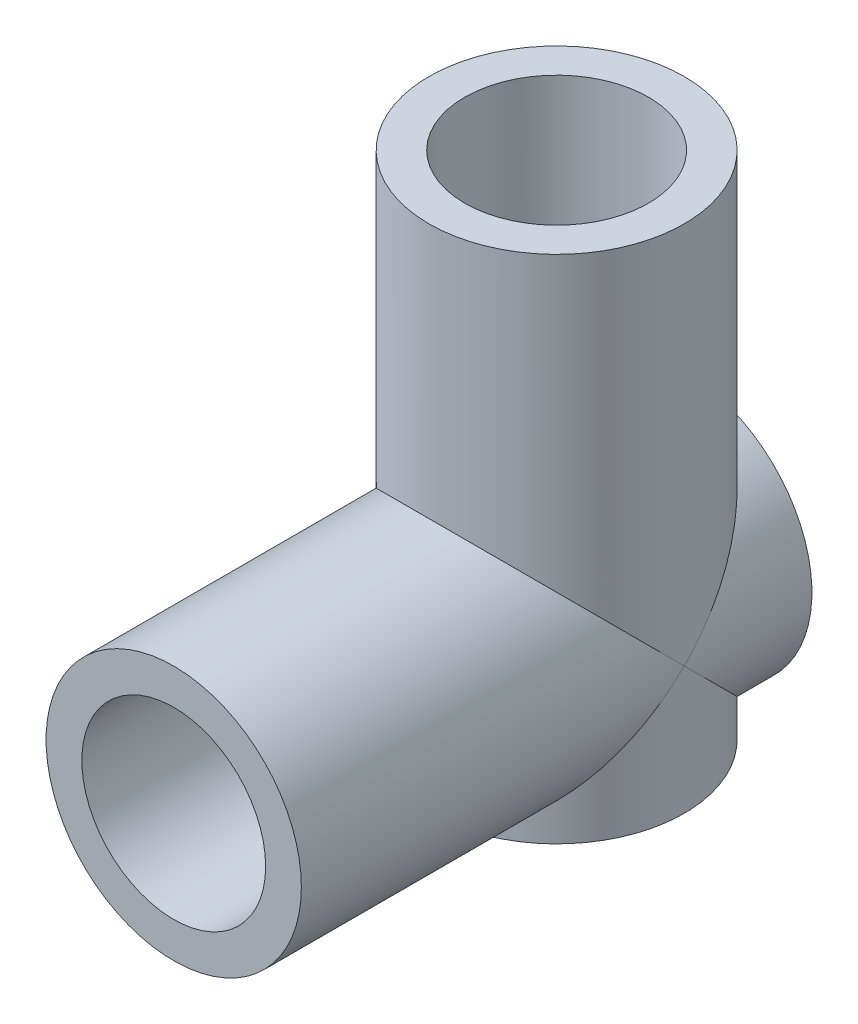
ISO-10303-21;
HEADER;
FILE_DESCRIPTION(('STEP AP214'),'2;1');
FILE_NAME('part.step','',(''),(''),'','','');
FILE_SCHEMA(('AUTOMOTIVE_DESIGN { 1 0 10303 214 1 1 1 1 }'));
ENDSEC;
DATA;
#1=APPLICATION_CONTEXT('core data for automotive mechanical design processes');
#2=APPLICATION_PROTOCOL_DEFINITION('international standard','automotive_design',2000,#1);
#3=PRODUCT_CONTEXT('',#1,'mechanical');
#4=PRODUCT('Part','Part','',(#3));
#5=PRODUCT_RELATED_PRODUCT_CATEGORY('part','',(#4));
#6=PRODUCT_DEFINITION_FORMATION('','',#4);
#7=PRODUCT_DEFINITION_CONTEXT('part definition',#1,'design');
#8=PRODUCT_DEFINITION('design','',#6,#7);
#9=PRODUCT_DEFINITION_SHAPE('','',#8);
#10=(LENGTH_UNIT() NAMED_UNIT(*) SI_UNIT(.MILLI.,.METRE.));
#11=(NAMED_UNIT(*) PLANE_ANGLE_UNIT() SI_UNIT($,.RADIAN.));
#12=(NAMED_UNIT(*) SI_UNIT($,.STERADIAN.) SOLID_ANGLE_UNIT());
#13=UNCERTAINTY_MEASURE_WITH_UNIT(LENGTH_MEASURE(1.E-05),#10,'distance_accuracy_value','');
#14=(GEOMETRIC_REPRESENTATION_CONTEXT(3) GLOBAL_UNCERTAINTY_ASSIGNED_CONTEXT((#13)) GLOBAL_UNIT_ASSIGNED_CONTEXT((#10,
#11,#12)) REPRESENTATION_CONTEXT('',''));
#15=CARTESIAN_POINT('',(0.,0.,0.));
#16=DIRECTION('',(0.,0.,1.));
#17=DIRECTION('',(1.,0.,0.));
#18=AXIS2_PLACEMENT_3D('',#15,#16,#17);
#19=CARTESIAN_POINT('',(0.,11.25,3.75));
#20=DIRECTION('',(0.,-1.,0.));
#21=DIRECTION('',(0.,0.,-1.));
#22=AXIS2_PLACEMENT_3D('',#19,#20,#21);
#23=CYLINDRICAL_SURFACE('',#22,2.7);
#24=CARTESIAN_POINT('',(0.,11.25,3.75));
#25=DIRECTION('',(0.,1.,0.));
#26=DIRECTION('',(0.,0.,1.));
#27=AXIS2_PLACEMENT_3D('',#24,#25,#26);
#28=CIRCLE('',#27,2.7);
#29=CARTESIAN_POINT('',(0.,11.25,6.45));
#30=VERTEX_POINT('',#29);
#31=EDGE_CURVE('E276',#30,#30,#28,.T.);
#32=ORIENTED_EDGE('',*,*,#31,.T.);
#33=EDGE_LOOP('',(#32));
#34=FACE_BOUND('',#33,.T.);
#35=CARTESIAN_POINT('',(0.,0.,3.75));
#36=DIRECTION('',(0.,-0.707106781186547,-0.707106781186547));
#37=DIRECTION('',(0.,-0.707106781186547,0.707106781186547));
#38=AXIS2_PLACEMENT_3D('',#35,#36,#37);
#39=ELLIPSE('',#38,3.81837661840736,2.7);
#40=CARTESIAN_POINT('',(-2.59374246986859,0.750000000000001,3.));
#41=VERTEX_POINT('',#40);
#42=CARTESIAN_POINT('',(-2.7,0.,3.75));
#43=VERTEX_POINT('',#42);
#44=EDGE_CURVE('E55',#41,#43,#39,.F.);
#45=ORIENTED_EDGE('',*,*,#44,.F.);
#46=DIRECTION('',(0.,-1.,0.));
#47=VECTOR('',#46,1.);
#48=CARTESIAN_POINT('',(-2.59374246986859,11.25,3.));
#49=LINE('',#48,#47);
#50=CARTESIAN_POINT('',(-2.59374246986859,-0.750000000000001,3.));
#51=VERTEX_POINT('',#50);
#52=EDGE_CURVE('E121',#41,#51,#49,.T.);
#53=ORIENTED_EDGE('',*,*,#52,.T.);
#54=CARTESIAN_POINT('',(0.,0.,3.75));
#55=DIRECTION('',(0.,0.707106781186547,-0.707106781186547));
#56=DIRECTION('',(0.,-0.707106781186547,-0.707106781186547));
#57=AXIS2_PLACEMENT_3D('',#54,#55,#56);
#58=ELLIPSE('',#57,3.81837661840736,2.7);
#59=CARTESIAN_POINT('',(2.59374246986859,-0.750000000000001,3.));
#60=VERTEX_POINT('',#59);
#61=EDGE_CURVE('E163',#51,#60,#58,.F.);
#62=ORIENTED_EDGE('',*,*,#61,.T.);
#63=DIRECTION('',(0.,-1.,0.));
#64=VECTOR('',#63,1.);
#65=CARTESIAN_POINT('',(2.59374246986859,11.25,3.));
#66=LINE('',#65,#64);
#67=CARTESIAN_POINT('',(2.59374246986859,0.750000000000001,3.));
#68=VERTEX_POINT('',#67);
#69=EDGE_CURVE('E128',#60,#68,#66,.F.);
#70=ORIENTED_EDGE('',*,*,#69,.T.);
#71=CARTESIAN_POINT('',(2.7,0.,3.75));
#72=VERTEX_POINT('',#71);
#73=EDGE_CURVE('E138',#72,#68,#39,.F.);
#74=ORIENTED_EDGE('',*,*,#73,.F.);
#75=CARTESIAN_POINT('',(0.,0.,3.75));
#76=DIRECTION('',(0.,-0.707106781186547,0.707106781186547));
#77=DIRECTION('',(0.,-0.707106781186547,-0.707106781186547));
#78=AXIS2_PLACEMENT_3D('',#75,#76,#77);
#79=ELLIPSE('',#78,3.81837661840736,2.7);
#80=EDGE_CURVE('E136',#43,#72,#79,.F.);
#81=ORIENTED_EDGE('',*,*,#80,.F.);
#82=EDGE_LOOP('',(#45,#53,#62,#70,#74,#81));
#83=FACE_BOUND('',#82,.T.);
#84=ADVANCED_FACE('F38',(#34,#83),#23,.F.);
#85=CARTESIAN_POINT('',(0.,0.,3.75));
#86=DIRECTION('',(0.,-0.707106781186547,-0.707106781186547));
#87=DIRECTION('',(0.,-0.707106781186547,0.707106781186547));
#88=AXIS2_PLACEMENT_3D('',#85,#86,#87);
#89=ELLIPSE('',#88,3.81837661840736,2.7);
#90=CARTESIAN_POINT('',(-2.59374246986859,-0.75,4.5));
#91=VERTEX_POINT('',#90);
#92=EDGE_CURVE('E139',#91,#43,#89,.T.);
#93=ORIENTED_EDGE('',*,*,#92,.F.);
#94=CARTESIAN_POINT('',(0.,-0.750000000000001,3.75));
#95=DIRECTION('',(0.,1.,0.));
#96=DIRECTION('',(0.,0.,1.));
#97=AXIS2_PLACEMENT_3D('',#94,#95,#96);
#98=CIRCLE('',#97,2.7);
#99=EDGE_CURVE('E147',#51,#91,#98,.T.);
#100=ORIENTED_EDGE('',*,*,#99,.F.);
#101=CARTESIAN_POINT('',(0.,0.,3.75));
#102=DIRECTION('',(0.,-0.707106781186547,0.707106781186547));
#103=DIRECTION('',(0.,-0.707106781186547,-0.707106781186547));
#104=AXIS2_PLACEMENT_3D('',#101,#102,#103);
#105=ELLIPSE('',#104,3.81837661840736,2.7);
#106=EDGE_CURVE('E132',#43,#51,#105,.T.);
#107=ORIENTED_EDGE('',*,*,#106,.F.);
#108=EDGE_LOOP('',(#93,#100,#107));
#109=FACE_BOUND('',#108,.T.);
#110=ADVANCED_FACE('F178',(#109),#23,.F.);
#111=EDGE_CURVE('E127',#60,#72,#105,.T.);
#112=ORIENTED_EDGE('',*,*,#111,.F.);
#113=CARTESIAN_POINT('',(2.59374246986859,-0.750000000000001,4.5));
#114=VERTEX_POINT('',#113);
#115=EDGE_CURVE('E159',#114,#60,#98,.T.);
#116=ORIENTED_EDGE('',*,*,#115,.F.);
#117=EDGE_CURVE('E143',#72,#114,#89,.T.);
#118=ORIENTED_EDGE('',*,*,#117,.F.);
#119=EDGE_LOOP('',(#112,#116,#118));
#120=FACE_BOUND('',#119,.T.);
#121=ADVANCED_FACE('F158',(#120),#23,.F.);
#122=CARTESIAN_POINT('',(0.,0.,15.));
#123=DIRECTION('',(0.,0.,-1.));
#124=DIRECTION('',(-1.,0.,0.));
#125=AXIS2_PLACEMENT_3D('',#122,#123,#124);
#126=CYLINDRICAL_SURFACE('',#125,2.7);
#127=CARTESIAN_POINT('',(0.,0.,15.));
#128=DIRECTION('',(0.,0.,1.));
#129=DIRECTION('',(1.,0.,0.));
#130=AXIS2_PLACEMENT_3D('',#127,#128,#129);
#131=CIRCLE('',#130,2.7);
#132=CARTESIAN_POINT('',(2.7,0.,15.));
#133=VERTEX_POINT('',#132);
#134=EDGE_CURVE('E353',#133,#133,#131,.T.);
#135=ORIENTED_EDGE('',*,*,#134,.T.);
#136=EDGE_LOOP('',(#135));
#137=FACE_BOUND('',#136,.T.);
#138=ORIENTED_EDGE('',*,*,#117,.T.);
#139=DIRECTION('',(0.,0.,-1.));
#140=VECTOR('',#139,1.);
#141=CARTESIAN_POINT('',(2.59374246986859,-0.750000000000001,15.));
#142=LINE('',#141,#140);
#143=EDGE_CURVE('E271',#114,#60,#142,.T.);
#144=ORIENTED_EDGE('',*,*,#143,.T.);
#145=ORIENTED_EDGE('',*,*,#61,.F.);
#146=DIRECTION('',(0.,0.,-1.));
#147=VECTOR('',#146,1.);
#148=CARTESIAN_POINT('',(-2.59374246986859,-0.750000000000001,15.));
#149=LINE('',#148,#147);
#150=EDGE_CURVE('E556',#51,#91,#149,.F.);
#151=ORIENTED_EDGE('',*,*,#150,.T.);
#152=ORIENTED_EDGE('',*,*,#92,.T.);
#153=ORIENTED_EDGE('',*,*,#80,.T.);
#154=EDGE_LOOP('',(#138,#144,#145,#151,#152,#153));
#155=FACE_BOUND('',#154,.T.);
#156=ADVANCED_FACE('F40',(#137,#155),#126,.F.);
#157=CARTESIAN_POINT('',(0.,0.,15.));
#158=DIRECTION('',(0.,0.,-1.));
#159=DIRECTION('',(-1.,0.,0.));
#160=AXIS2_PLACEMENT_3D('',#157,#158,#159);
#161=CYLINDRICAL_SURFACE('',#160,3.75);
#162=CARTESIAN_POINT('',(0.,0.,15.));
#163=DIRECTION('',(0.,0.,1.));
#164=DIRECTION('',(1.,0.,0.));
#165=AXIS2_PLACEMENT_3D('',#162,#163,#164);
#166=CIRCLE('',#165,3.75);
#167=CARTESIAN_POINT('',(3.75,0.,15.));
#168=VERTEX_POINT('',#167);
#169=EDGE_CURVE('E355',#168,#168,#166,.T.);
#170=ORIENTED_EDGE('',*,*,#169,.F.);
#171=EDGE_LOOP('',(#170));
#172=FACE_BOUND('',#171,.T.);
#173=CARTESIAN_POINT('',(0.,0.,3.75));
#174=DIRECTION('',(0.,-0.707106781186547,-0.707106781186547));
#175=DIRECTION('',(0.,0.707106781186547,-0.707106781186547));
#176=AXIS2_PLACEMENT_3D('',#173,#174,#175);
#177=ELLIPSE('',#176,5.30330085889911,3.75);
#178=CARTESIAN_POINT('',(3.75,0.,3.75));
#179=VERTEX_POINT('',#178);
#180=CARTESIAN_POINT('',(0.,-3.75,7.5));
#181=VERTEX_POINT('',#180);
#182=EDGE_CURVE('E348',#179,#181,#177,.T.);
#183=ORIENTED_EDGE('',*,*,#182,.F.);
#184=CARTESIAN_POINT('',(0.,0.,3.75));
#185=DIRECTION('',(0.,0.707106781186547,-0.707106781186547));
#186=DIRECTION('',(0.,-0.707106781186547,-0.707106781186547));
#187=AXIS2_PLACEMENT_3D('',#184,#185,#186);
#188=ELLIPSE('',#187,5.30330085889911,3.75);
#189=CARTESIAN_POINT('',(-3.75,0.,3.75));
#190=VERTEX_POINT('',#189);
#191=EDGE_CURVE('E340',#190,#179,#188,.T.);
#192=ORIENTED_EDGE('',*,*,#191,.F.);
#193=EDGE_CURVE('E345',#181,#190,#177,.T.);
#194=ORIENTED_EDGE('',*,*,#193,.F.);
#195=EDGE_LOOP('',(#183,#192,#194));
#196=FACE_BOUND('',#195,.T.);
#197=ADVANCED_FACE('F195',(#172,#196),#161,.T.);
#198=CARTESIAN_POINT('',(0.,0.,15.));
#199=DIRECTION('',(0.,0.,1.));
#200=DIRECTION('',(1.,0.,0.));
#201=AXIS2_PLACEMENT_3D('',#198,#199,#200);
#202=PLANE('',#201);
#203=ORIENTED_EDGE('',*,*,#134,.F.);
#204=EDGE_LOOP('',(#203));
#205=FACE_BOUND('',#204,.T.);
#206=ORIENTED_EDGE('',*,*,#169,.T.);
#207=EDGE_LOOP('',(#206));
#208=FACE_BOUND('',#207,.T.);
#209=ADVANCED_FACE('F302',(#205,#208),#202,.T.);
#210=CARTESIAN_POINT('',(0.,11.25,3.75));
#211=DIRECTION('',(0.,-1.,0.));
#212=DIRECTION('',(0.,0.,-1.));
#213=AXIS2_PLACEMENT_3D('',#210,#211,#212);
#214=CYLINDRICAL_SURFACE('',#213,3.75);
#215=CARTESIAN_POINT('',(0.,11.25,3.75));
#216=DIRECTION('',(0.,1.,0.));
#217=DIRECTION('',(0.,0.,1.));
#218=AXIS2_PLACEMENT_3D('',#215,#216,#217);
#219=CIRCLE('',#218,3.75);
#220=CARTESIAN_POINT('',(0.,11.25,7.5));
#221=VERTEX_POINT('',#220);
#222=EDGE_CURVE('E279',#221,#221,#219,.T.);
#223=ORIENTED_EDGE('',*,*,#222,.F.);
#224=EDGE_LOOP('',(#223));
#225=FACE_BOUND('',#224,.T.);
#226=ORIENTED_EDGE('',*,*,#191,.T.);
#227=CARTESIAN_POINT('',(0.,0.,3.75));
#228=DIRECTION('',(0.,-0.707106781186547,-0.707106781186547));
#229=DIRECTION('',(0.,0.707106781186547,-0.707106781186547));
#230=AXIS2_PLACEMENT_3D('',#227,#228,#229);
#231=ELLIPSE('',#230,5.30330085889911,3.75);
#232=CARTESIAN_POINT('',(0.,3.75,0.));
#233=VERTEX_POINT('',#232);
#234=EDGE_CURVE('E289',#179,#233,#231,.F.);
#235=ORIENTED_EDGE('',*,*,#234,.T.);
#236=EDGE_CURVE('E282',#233,#190,#231,.F.);
#237=ORIENTED_EDGE('',*,*,#236,.T.);
#238=EDGE_LOOP('',(#226,#235,#237));
#239=FACE_BOUND('',#238,.T.);
#240=ADVANCED_FACE('F249',(#225,#239),#214,.T.);
#241=CARTESIAN_POINT('',(0.,11.25,3.75));
#242=DIRECTION('',(0.,1.,0.));
#243=DIRECTION('',(0.,0.,1.));
#244=AXIS2_PLACEMENT_3D('',#241,#242,#243);
#245=PLANE('',#244);
#246=ORIENTED_EDGE('',*,*,#222,.T.);
#247=EDGE_LOOP('',(#246));
#248=FACE_BOUND('',#247,.T.);
#249=ORIENTED_EDGE('',*,*,#31,.F.);
#250=EDGE_LOOP('',(#249));
#251=FACE_BOUND('',#250,.T.);
#252=ADVANCED_FACE('F377',(#248,#251),#245,.T.);
#253=CARTESIAN_POINT('',(0.,-3.75,3.75));
#254=DIRECTION('',(0.,1.,0.));
#255=DIRECTION('',(0.,0.,1.));
#256=AXIS2_PLACEMENT_3D('',#253,#254,#255);
#257=CIRCLE('',#256,3.75);
#258=CARTESIAN_POINT('',(0.,-3.75,0.));
#259=VERTEX_POINT('',#258);
#260=EDGE_CURVE('E278',#259,#181,#257,.T.);
#261=ORIENTED_EDGE('',*,*,#260,.T.);
#262=ORIENTED_EDGE('',*,*,#193,.T.);
#263=CARTESIAN_POINT('',(0.,0.,3.75));
#264=DIRECTION('',(0.,0.707106781186547,-0.707106781186547));
#265=DIRECTION('',(0.,-0.707106781186547,-0.707106781186547));
#266=AXIS2_PLACEMENT_3D('',#263,#264,#265);
#267=ELLIPSE('',#266,5.30330085889911,3.75);
#268=EDGE_CURVE('E296',#190,#259,#267,.F.);
#269=ORIENTED_EDGE('',*,*,#268,.T.);
#270=EDGE_LOOP('',(#261,#262,#269));
#271=FACE_BOUND('',#270,.T.);
#272=ADVANCED_FACE('F258',(#271),#214,.T.);
#273=EDGE_CURVE('E334',#259,#179,#267,.F.);
#274=ORIENTED_EDGE('',*,*,#273,.T.);
#275=ORIENTED_EDGE('',*,*,#182,.T.);
#276=EDGE_CURVE('E283',#181,#259,#257,.T.);
#277=ORIENTED_EDGE('',*,*,#276,.T.);
#278=EDGE_LOOP('',(#274,#275,#277));
#279=FACE_BOUND('',#278,.T.);
#280=ADVANCED_FACE('F371',(#279),#214,.T.);
#281=CARTESIAN_POINT('',(0.,-3.75,3.75));
#282=DIRECTION('',(0.,1.,0.));
#283=DIRECTION('',(0.,0.,1.));
#284=AXIS2_PLACEMENT_3D('',#281,#282,#283);
#285=PLANE('',#284);
#286=ORIENTED_EDGE('',*,*,#276,.F.);
#287=ORIENTED_EDGE('',*,*,#260,.F.);
#288=EDGE_LOOP('',(#286,#287));
#289=FACE_BOUND('',#288,.T.);
#290=ADVANCED_FACE('F301',(#289),#285,.F.);
#291=CARTESIAN_POINT('',(0.,0.,0.));
#292=DIRECTION('',(0.,0.,1.));
#293=DIRECTION('',(1.,0.,0.));
#294=AXIS2_PLACEMENT_3D('',#291,#292,#293);
#295=PLANE('',#294);
#296=CARTESIAN_POINT('',(0.,0.,0.));
#297=DIRECTION('',(0.,0.,1.));
#298=DIRECTION('',(1.,0.,0.));
#299=AXIS2_PLACEMENT_3D('',#296,#297,#298);
#300=CIRCLE('',#299,3.75);
#301=EDGE_CURVE('E352',#259,#233,#300,.T.);
#302=ORIENTED_EDGE('',*,*,#301,.F.);
#303=EDGE_CURVE('E321',#233,#259,#300,.T.);
#304=ORIENTED_EDGE('',*,*,#303,.F.);
#305=EDGE_LOOP('',(#302,#304));
#306=FACE_BOUND('',#305,.T.);
#307=ADVANCED_FACE('F306',(#306),#295,.F.);
#308=ORIENTED_EDGE('',*,*,#234,.F.);
#309=ORIENTED_EDGE('',*,*,#273,.F.);
#310=ORIENTED_EDGE('',*,*,#301,.T.);
#311=EDGE_LOOP('',(#308,#309,#310));
#312=FACE_BOUND('',#311,.T.);
#313=ADVANCED_FACE('F209',(#312),#161,.T.);
#314=ORIENTED_EDGE('',*,*,#268,.F.);
#315=ORIENTED_EDGE('',*,*,#236,.F.);
#316=ORIENTED_EDGE('',*,*,#303,.T.);
#317=EDGE_LOOP('',(#314,#315,#316));
#318=FACE_BOUND('',#317,.T.);
#319=ADVANCED_FACE('F232',(#318),#161,.T.);
#320=CARTESIAN_POINT('',(0.,-0.750000000000001,3.75));
#321=DIRECTION('',(0.,1.,0.));
#322=DIRECTION('',(0.,0.,1.));
#323=AXIS2_PLACEMENT_3D('',#320,#321,#322);
#324=PLANE('',#323);
#325=ORIENTED_EDGE('',*,*,#99,.T.);
#326=ORIENTED_EDGE('',*,*,#150,.F.);
#327=EDGE_LOOP('',(#325,#326));
#328=FACE_BOUND('',#327,.T.);
#329=ADVANCED_FACE('F173',(#328),#324,.T.);
#330=ORIENTED_EDGE('',*,*,#115,.T.);
#331=ORIENTED_EDGE('',*,*,#143,.F.);
#332=EDGE_LOOP('',(#330,#331));
#333=FACE_BOUND('',#332,.T.);
#334=ADVANCED_FACE('F166',(#333),#324,.T.);
#335=CARTESIAN_POINT('',(0.,0.,3.));
#336=DIRECTION('',(0.,0.,1.));
#337=DIRECTION('',(1.,0.,0.));
#338=AXIS2_PLACEMENT_3D('',#335,#336,#337);
#339=PLANE('',#338);
#340=CARTESIAN_POINT('',(0.,0.,3.));
#341=DIRECTION('',(0.,0.,1.));
#342=DIRECTION('',(1.,0.,0.));
#343=AXIS2_PLACEMENT_3D('',#340,#341,#342);
#344=CIRCLE('',#343,2.7);
#345=EDGE_CURVE('E62',#60,#68,#344,.T.);
#346=ORIENTED_EDGE('',*,*,#345,.T.);
#347=ORIENTED_EDGE('',*,*,#69,.F.);
#348=EDGE_LOOP('',(#346,#347));
#349=FACE_BOUND('',#348,.T.);
#350=ADVANCED_FACE('F164',(#349),#339,.T.);
#351=CARTESIAN_POINT('',(0.,0.,3.));
#352=DIRECTION('',(0.,0.,1.));
#353=DIRECTION('',(1.,0.,0.));
#354=AXIS2_PLACEMENT_3D('',#351,#352,#353);
#355=CYLINDRICAL_SURFACE('',#354,2.7);
#356=ORIENTED_EDGE('',*,*,#73,.T.);
#357=ORIENTED_EDGE('',*,*,#345,.F.);
#358=ORIENTED_EDGE('',*,*,#111,.T.);
#359=EDGE_LOOP('',(#356,#357,#358));
#360=FACE_BOUND('',#359,.T.);
#361=ADVANCED_FACE('F154',(#360),#355,.F.);
#362=ORIENTED_EDGE('',*,*,#106,.T.);
#363=EDGE_CURVE('E123',#41,#51,#344,.T.);
#364=ORIENTED_EDGE('',*,*,#363,.F.);
#365=ORIENTED_EDGE('',*,*,#44,.T.);
#366=EDGE_LOOP('',(#362,#364,#365));
#367=FACE_BOUND('',#366,.T.);
#368=ADVANCED_FACE('F130',(#367),#355,.F.);
#369=ORIENTED_EDGE('',*,*,#363,.T.);
#370=ORIENTED_EDGE('',*,*,#52,.F.);
#371=EDGE_LOOP('',(#369,#370));
#372=FACE_BOUND('',#371,.T.);
#373=ADVANCED_FACE('F122',(#372),#339,.T.);
#374=CLOSED_SHELL('',(#84,#110,#121,#156,#197,#209,#240,#252,#272,#280,#290,#307,#313,#319,#329,
#334,#350,#361,#368,#373));
#375=CARTESIAN_POINT('',(0.,0.,1.));
#376=DIRECTION('',(0.,0.,-1.));
#377=DIRECTION('',(-1.,0.,0.));
#378=AXIS2_PLACEMENT_3D('',#375,#376,#377);
#379=PLANE('',#378);
#380=CARTESIAN_POINT('',(0.,0.,1.));
#381=DIRECTION('',(0.,0.,-1.));
#382=DIRECTION('',(-1.,0.,0.));
#383=AXIS2_PLACEMENT_3D('',#380,#381,#382);
#384=CIRCLE('',#383,2.7);
#385=CARTESIAN_POINT('',(2.54950975679663,0.888819441731445,1.00000000000022));
#386=VERTEX_POINT('',#385);
#387=CARTESIAN_POINT('',(2.54950975679639,-0.888819441731558,1.));
#388=VERTEX_POINT('',#387);
#389=EDGE_CURVE('E261',#386,#388,#384,.T.);
#390=ORIENTED_EDGE('',*,*,#389,.F.);
#391=DIRECTION('',(0.,-1.,0.));
#392=VECTOR('',#391,1.);
#393=CARTESIAN_POINT('',(2.54950975679639,11.25,1.));
#394=LINE('',#393,#392);
#395=EDGE_CURVE('E11',#386,#388,#394,.T.);
#396=ORIENTED_EDGE('',*,*,#395,.T.);
#397=EDGE_LOOP('',(#390,#396));
#398=FACE_BOUND('',#397,.T.);
#399=ADVANCED_FACE('F242',(#398),#379,.F.);
#400=ORIENTED_EDGE('',*,*,#395,.F.);
#401=CARTESIAN_POINT('',(-2.7,0.,1.14759726406538));
#402=CARTESIAN_POINT('',(-2.69999939787829,-0.0640736617177556,1.14759611021147));
#403=CARTESIAN_POINT('',(-2.69771191598753,-0.128156673402649,1.14521619473387));
#404=CARTESIAN_POINT('',(-2.68862930386138,-0.255676984738211,1.1358444234419));
#405=CARTESIAN_POINT('',(-2.6818313668134,-0.319113857328727,1.12884969588996));
#406=CARTESIAN_POINT('',(-2.65484934274652,-0.507836806406356,1.10142206139335));
#407=CARTESIAN_POINT('',(-2.62807782134155,-0.631316754364158,1.07454762710945));
#408=CARTESIAN_POINT('',(-2.55944380197688,-0.868556465200221,1.0088463251006));
#409=CARTESIAN_POINT('',(-2.51777174323211,-0.98241743143895,0.970171154784505));
#410=CARTESIAN_POINT('',(-2.42101842938286,-1.20123813487395,0.885508546991161));
#411=CARTESIAN_POINT('',(-2.36593854131307,-1.30619877805873,0.839521855147293));
#412=CARTESIAN_POINT('',(-2.23190897159926,-1.52581276652076,0.735108588280606));
#413=CARTESIAN_POINT('',(-2.15041831114257,-1.6385767126401,0.675968978262093));
#414=CARTESIAN_POINT('',(-1.97101062790652,-1.85052397169396,0.557945828417283));
#415=CARTESIAN_POINT('',(-1.87307172913589,-1.94968887468724,0.499062738197264));
#416=CARTESIAN_POINT('',(-1.64212846752267,-2.14957739456943,0.375696798804886));
#417=CARTESIAN_POINT('',(-1.50598577450953,-2.24733967764022,0.312127045841083));
#418=CARTESIAN_POINT('',(-1.28709328109365,-2.37497967495229,0.226926042273875));
#419=CARTESIAN_POINT('',(-1.21170663525511,-2.41435045945474,0.200224235878327));
#420=CARTESIAN_POINT('',(-1.05645044989245,-2.48620700266395,0.150967230970749));
#421=CARTESIAN_POINT('',(-0.97658304347183,-2.51869600290721,0.128410080862154));
#422=CARTESIAN_POINT('',(-0.777341569351212,-2.5886664774559,0.0794663078172081));
#423=CARTESIAN_POINT('',(-0.655882704245433,-2.62218150836817,0.0556757516964917));
#424=CARTESIAN_POINT('',(-0.407853222168502,-2.67201020497653,0.0201430880431062));
#425=CARTESIAN_POINT('',(-0.281286936778434,-2.68833814134837,0.00839098503889965));
#426=CARTESIAN_POINT('',(-0.0262755325692087,-2.70289598126775,-0.00208202203026507));
#427=CARTESIAN_POINT('',(0.102173094364013,-2.70108616504391,-0.000774326531319674));
#428=CARTESIAN_POINT('',(0.356733487679122,-2.67937894078467,0.0148271749298036));
#429=CARTESIAN_POINT('',(0.48284462715453,-2.65947675005739,0.0291244146578076));
#430=CARTESIAN_POINT('',(0.725804132068693,-2.60352421165076,0.068904318894262));
#431=CARTESIAN_POINT('',(0.842811312014833,-2.56792903590878,0.0940713167872727));
#432=CARTESIAN_POINT('',(1.06888155703508,-2.48236109249057,0.153657978004469));
#433=CARTESIAN_POINT('',(1.17794303018316,-2.4323854535548,0.18807948903076));
#434=CARTESIAN_POINT('',(1.39820602527996,-2.3135213271322,0.268227718718194));
#435=CARTESIAN_POINT('',(1.50829866917687,-2.24314831633131,0.314785651578608));
#436=CARTESIAN_POINT('',(1.71572142211418,-2.08879056844701,0.413531064296022));
#437=CARTESIAN_POINT('',(1.81303856436294,-2.00479219231453,0.465724167293105));
#438=CARTESIAN_POINT('',(2.01113899742768,-1.80785013578542,0.582450980639341));
#439=CARTESIAN_POINT('',(2.10917955977149,-1.69243011925118,0.64746989628678));
#440=CARTESIAN_POINT('',(2.28529875370958,-1.44581148273329,0.774819979765398));
#441=CARTESIAN_POINT('',(2.36337667765494,-1.3146123036417,0.837151052251023));
#442=CARTESIAN_POINT('',(2.48268830665291,-1.06799763168713,0.938687408780466));
#443=CARTESIAN_POINT('',(2.52825316471648,-0.955538917604088,0.979955256330476));
#444=CARTESIAN_POINT('',(2.60443594780843,-0.722407076583776,1.05145238349396));
#445=CARTESIAN_POINT('',(2.63508715781083,-0.60175293340626,1.08170620633871));
#446=CARTESIAN_POINT('',(2.67616421145072,-0.373430517213602,1.12295368576961));
#447=CARTESIAN_POINT('',(2.68897085226149,-0.266608274818528,1.13618946818363));
#448=CARTESIAN_POINT('',(2.70165691494759,-0.0514047857686024,1.14929883311594));
#449=CARTESIAN_POINT('',(2.70154568028646,0.056975277385506,1.14918207349183));
#450=CARTESIAN_POINT('',(2.68843200878899,0.271871953654423,1.13563427111689));
#451=CARTESIAN_POINT('',(2.6754517672448,0.37839145382623,1.12222615209895));
#452=CARTESIAN_POINT('',(2.637509697413,0.587238172698691,1.08415122935319));
#453=CARTESIAN_POINT('',(2.61252987199433,0.68955884292164,1.05946751708195));
#454=CARTESIAN_POINT('',(2.53927932298516,0.929296798922283,0.989923328349104));
#455=CARTESIAN_POINT('',(2.48565632358791,1.06386649385171,0.940939773297805));
#456=CARTESIAN_POINT('',(2.35960196453178,1.32013694702323,0.834248252486908));
#457=CARTESIAN_POINT('',(2.28713337797037,1.44181155551758,0.776523114259305));
#458=CARTESIAN_POINT('',(2.12267937523455,1.67484785746995,0.656883109160696));
#459=CARTESIAN_POINT('',(2.03020662464667,1.78582796381177,0.594896331327516));
#460=CARTESIAN_POINT('',(1.82798662035785,1.9923124433915,0.473591801147687));
#461=CARTESIAN_POINT('',(1.71825516451885,2.08783080894638,0.414271671101118));
#462=CARTESIAN_POINT('',(1.48994181902569,2.25584963244362,0.306529323803013));
#463=CARTESIAN_POINT('',(1.37237497328244,2.32943159529569,0.257652737299788));
#464=CARTESIAN_POINT('',(1.1241605827699,2.45881550238783,0.170055535606356));
#465=CARTESIAN_POINT('',(0.993517584866632,2.51462359895847,0.131331407018489));
#466=CARTESIAN_POINT('',(0.789490679377153,2.5830088955535,0.0833697096169206));
#467=CARTESIAN_POINT('',(0.719799429197284,2.60330681979609,0.069027758881455));
#468=CARTESIAN_POINT('',(0.578376501843028,2.63832835082989,0.0441773160775242));
#469=CARTESIAN_POINT('',(0.506645896601047,2.65305482992197,0.0336668488295547));
#470=CARTESIAN_POINT('',(0.361782695932498,2.67665733782405,0.0167806948418752));
#471=CARTESIAN_POINT('',(0.288650864086587,2.68553646472323,0.0104028185698346));
#472=CARTESIAN_POINT('',(0.141685501765607,2.69728905813915,0.00195331911204851));
#473=CARTESIAN_POINT('',(0.0678520739654772,2.70016339023266,-0.000118924720059439));
#474=CARTESIAN_POINT('',(-0.133511955274934,2.69969971739462,0.000218419548744509));
#475=CARTESIAN_POINT('',(-0.261097375169332,2.69033394440266,0.0069759372192927));
#476=CARTESIAN_POINT('',(-0.512320628556032,2.65399244884766,0.0330090092367844));
#477=CARTESIAN_POINT('',(-0.635958182672346,2.62701548288923,0.0522854474511278));
#478=CARTESIAN_POINT('',(-0.874733350800632,2.55736619061576,0.101435683809768));
#479=CARTESIAN_POINT('',(-0.989956872718806,2.51489118974671,0.131176088714073));
#480=CARTESIAN_POINT('',(-1.2114795748562,2.41599895045881,0.199188106386592));
#481=CARTESIAN_POINT('',(-1.31777728502839,2.35957942143985,0.237461120663913));
#482=CARTESIAN_POINT('',(-1.53403306260346,2.22598949871027,0.325868339736927));
#483=CARTESIAN_POINT('',(-1.64251648578864,2.14703916460753,0.376908131971863));
#484=CARTESIAN_POINT('',(-1.84552429696845,1.97528682688366,0.483545831031803));
#485=CARTESIAN_POINT('',(-1.94002801246686,1.88246470985756,0.539150302764987));
#486=CARTESIAN_POINT('',(-2.13051464511385,1.66595637858726,0.661560809037661));
#487=CARTESIAN_POINT('',(-2.2235258325373,1.53973829459929,0.72853299006958));
#488=CARTESIAN_POINT('',(-2.38743848228664,1.27077912667247,0.856316281928799));
#489=CARTESIAN_POINT('',(-2.45835999500722,1.12805318896293,0.917132945953271));
#490=CARTESIAN_POINT('',(-2.55773047599992,0.872238827798278,1.0070829966326));
#491=CARTESIAN_POINT('',(-2.59253828211409,0.763049752437548,1.04025251815809));
#492=CARTESIAN_POINT('',(-2.64826304777186,0.538488594352145,1.09467514407431));
#493=CARTESIAN_POINT('',(-2.66922787873142,0.42313932681083,1.1159692754945));
#494=CARTESIAN_POINT('',(-2.68836388723557,0.255558325003359,1.13556790793356));
#495=CARTESIAN_POINT('',(-2.69271845587548,0.204666630144971,1.14006093674331));
#496=CARTESIAN_POINT('',(-2.69853716592189,0.102518685072766,1.14607650061648));
#497=CARTESIAN_POINT('',(-2.70000048172937,0.0512623349234449,1.14759818720983));
#498=CARTESIAN_POINT('',(-2.7,0.,1.14759726406538));
#499=B_SPLINE_CURVE_WITH_KNOTS('',3,(#401,#402,#403,#404,#405,#406,#407,#408,#409,#410,#411,
#412,#413,#414,#415,#416,#417,#418,#419,#420,#421,#422,#423,#424,#425,#426,#427,#428,#429,#430,
#431,#432,#433,#434,#435,#436,#437,#438,#439,#440,#441,#442,#443,#444,#445,#446,#447,#448,#449,
#450,#451,#452,#453,#454,#455,#456,#457,#458,#459,#460,#461,#462,#463,#464,#465,#466,#467,#468,
#469,#470,#471,#472,#473,#474,#475,#476,#477,#478,#479,#480,#481,#482,#483,#484,#485,#486,#487,
#488,#489,#490,#491,#492,#493,#494,#495,#496,#497,#498),.UNSPECIFIED.,.T.,.F.,(4,2,2,2,2,2,2,2,
2,2,2,2,2,2,2,2,2,2,2,2,2,2,2,2,2,2,2,2,2,2,2,2,2,2,2,2,2,2,2,2,2,2,2,2,2,2,2,2,4),(0.,
0.192148361021902,0.384416406394325,0.769596347452056,1.15001974672051,1.53040437503612,
1.98232555986836,2.43485262553041,2.96921747342157,3.23624545590685,3.50314737874232,
3.88604192106845,4.26861828952126,4.65203264275021,5.0355483804672,5.40860539086883,
5.78173693903874,6.19633131898625,6.61134330019695,7.10380879133639,7.59629173730166,
7.97950452684321,8.3618580757242,8.68557636859886,9.00906051838847,9.33198772101,
9.65540077341738,10.1116586188122,10.5688246778516,11.0387227813655,11.508193237535,
11.947634891174,12.3869242686495,12.6086124842847,12.8301862546094,13.0516425343601,
13.2730668895156,13.6553011786712,14.037562457467,14.4151174555792,14.7927345140893,
15.2218026512078,15.6514990629898,16.1608302309792,16.6696977319339,17.0264035906463,
17.3818693463659,17.5355543694565,17.6892832710618),.UNSPECIFIED.);
#500=EDGE_CURVE('E295',#388,#386,#499,.T.);
#501=ORIENTED_EDGE('',*,*,#500,.F.);
#502=EDGE_LOOP('',(#400,#501));
#503=FACE_BOUND('',#502,.T.);
#504=ADVANCED_FACE('F250',(#503),#214,.T.);
#505=ORIENTED_EDGE('',*,*,#500,.T.);
#506=ORIENTED_EDGE('',*,*,#389,.T.);
#507=EDGE_LOOP('',(#505,#506));
#508=FACE_BOUND('',#507,.T.);
#509=ADVANCED_FACE('F198',(#508),#126,.F.);
#510=CLOSED_SHELL('',(#399,#504,#509));
#511=CARTESIAN_POINT('',(-2.54950975679953,-0.888819441729727,1.0000000000028));
#512=VERTEX_POINT('',#511);
#513=CARTESIAN_POINT('',(-2.54950975679639,0.888819441731558,1.));
#514=VERTEX_POINT('',#513);
#515=EDGE_CURVE('E265',#512,#514,#384,.T.);
#516=ORIENTED_EDGE('',*,*,#515,.F.);
#517=DIRECTION('',(0.,-1.,0.));
#518=VECTOR('',#517,1.);
#519=CARTESIAN_POINT('',(-2.54950975679639,11.25,1.));
#520=LINE('',#519,#518);
#521=EDGE_CURVE('E48',#512,#514,#520,.F.);
#522=ORIENTED_EDGE('',*,*,#521,.T.);
#523=EDGE_LOOP('',(#516,#522));
#524=FACE_BOUND('',#523,.T.);
#525=ADVANCED_FACE('F237',(#524),#379,.F.);
#526=ORIENTED_EDGE('',*,*,#521,.F.);
#527=EDGE_CURVE('E288',#514,#512,#499,.T.);
#528=ORIENTED_EDGE('',*,*,#527,.F.);
#529=EDGE_LOOP('',(#526,#528));
#530=FACE_BOUND('',#529,.T.);
#531=ADVANCED_FACE('F239',(#530),#214,.T.);
#532=ORIENTED_EDGE('',*,*,#527,.T.);
#533=ORIENTED_EDGE('',*,*,#515,.T.);
#534=EDGE_LOOP('',(#532,#533));
#535=FACE_BOUND('',#534,.T.);
#536=ADVANCED_FACE('F197',(#535),#126,.F.);
#537=CLOSED_SHELL('',(#525,#531,#536));
#538=CARTESIAN_POINT('',(0.,-2.75,3.75));
#539=DIRECTION('',(0.,-1.,0.));
#540=DIRECTION('',(0.,0.,-1.));
#541=AXIS2_PLACEMENT_3D('',#538,#539,#540);
#542=PLANE('',#541);
#543=CARTESIAN_POINT('',(0.,-2.75,3.75));
#544=DIRECTION('',(0.,-1.,0.));
#545=DIRECTION('',(0.,0.,-1.));
#546=AXIS2_PLACEMENT_3D('',#543,#544,#545);
#547=CIRCLE('',#546,2.7);
#548=CARTESIAN_POINT('',(-2.54950975679639,-2.75,4.63881944173156));
#549=VERTEX_POINT('',#548);
#550=CARTESIAN_POINT('',(-2.54950975679639,-2.75,2.86118055826844));
#551=VERTEX_POINT('',#550);
#552=EDGE_CURVE('E264',#549,#551,#547,.T.);
#553=ORIENTED_EDGE('',*,*,#552,.F.);
#554=DIRECTION('',(0.,0.,-1.));
#555=VECTOR('',#554,1.);
#556=CARTESIAN_POINT('',(-2.54950975679639,-2.75,15.));
#557=LINE('',#556,#555);
#558=EDGE_CURVE('E325',#549,#551,#557,.T.);
#559=ORIENTED_EDGE('',*,*,#558,.T.);
#560=EDGE_LOOP('',(#553,#559));
#561=FACE_BOUND('',#560,.T.);
#562=ADVANCED_FACE('F220',(#561),#542,.F.);
#563=ORIENTED_EDGE('',*,*,#558,.F.);
#564=CARTESIAN_POINT('',(0.,-3.75,1.05));
#565=CARTESIAN_POINT('',(0.133303578871132,-3.74998861547845,1.05001205649375));
#566=CARTESIAN_POINT('',(0.266744727217668,-3.74282011915423,1.05994477834653));
#567=CARTESIAN_POINT('',(0.529213182535304,-3.71482368087317,1.09903930319452));
#568=CARTESIAN_POINT('',(0.658239028029969,-3.69399126126913,1.1282074096135));
#569=CARTESIAN_POINT('',(0.907768882231193,-3.64069479569625,1.20385106769569));
#570=CARTESIAN_POINT('',(1.02831191290205,-3.60828883726021,1.25024023201678));
#571=CARTESIAN_POINT('',(1.25925228613193,-3.53433323330348,1.35823137261447));
#572=CARTESIAN_POINT('',(1.36964820793195,-3.49278231009646,1.41983547478917));
#573=CARTESIAN_POINT('',(1.58843882601823,-3.39922942364585,1.56243836826652));
#574=CARTESIAN_POINT('',(1.69575643096733,-3.34662305326454,1.64468474013841));
#575=CARTESIAN_POINT('',(1.89602202997668,-3.23738238174629,1.823054409762));
#576=CARTESIAN_POINT('',(1.98894800673325,-3.18074209876783,1.91919854323317));
#577=CARTESIAN_POINT('',(2.17565748959946,-3.05675870615187,2.14325921814025));
#578=CARTESIAN_POINT('',(2.2663503856261,-2.98939526714593,2.27375495775212));
#579=CARTESIAN_POINT('',(2.42468212458482,-2.86246034162079,2.55150875495462));
#580=CARTESIAN_POINT('',(2.49235706121756,-2.80287674703612,2.6987400817404));
#581=CARTESIAN_POINT('',(2.58366526852249,-2.71840438184755,2.95820222331247));
#582=CARTESIAN_POINT('',(2.61446390403499,-2.68853260248931,3.06626757286076));
#583=CARTESIAN_POINT('',(2.66255767795742,-2.64091794596322,3.28785136163743));
#584=CARTESIAN_POINT('',(2.67988198400837,-2.62314888069418,3.40135745432734));
#585=CARTESIAN_POINT('',(2.699905887302,-2.60254560357217,3.63186345560124));
#586=CARTESIAN_POINT('',(2.70250519664826,-2.59981380999021,3.74888187870264));
#587=CARTESIAN_POINT('',(2.69257346051925,-2.61009273994795,3.98160959898755));
#588=CARTESIAN_POINT('',(2.68003047014681,-2.62311589168301,4.09731778988841));
#589=CARTESIAN_POINT('',(2.63841688222459,-2.66499557177524,4.33773373140478));
#590=CARTESIAN_POINT('',(2.60750804748993,-2.69559797829208,4.46180494994024));
#591=CARTESIAN_POINT('',(2.52998975300423,-2.76847708160939,4.70135969953246));
#592=CARTESIAN_POINT('',(2.48334484444842,-2.81078009738004,4.81682311623281));
#593=CARTESIAN_POINT('',(2.35881481806797,-2.91669620431171,5.07379705610463));
#594=CARTESIAN_POINT('',(2.27570721917125,-2.98278758763952,5.21174420312837));
#595=CARTESIAN_POINT('',(2.087278950525,-3.11756910501044,5.47013444227458));
#596=CARTESIAN_POINT('',(1.98193542343351,-3.18626185302905,5.59055930556863));
#597=CARTESIAN_POINT('',(1.74889426125048,-3.31995919920728,5.81340183298005));
#598=CARTESIAN_POINT('',(1.62096438319307,-3.38491515071314,5.9156077797096));
#599=CARTESIAN_POINT('',(1.34516351010487,-3.50363228951176,6.09682902317169));
#600=CARTESIAN_POINT('',(1.19733940978992,-3.55741906866971,6.17589750876972));
#601=CARTESIAN_POINT('',(0.925131346553805,-3.63610750721294,6.28968243192198));
#602=CARTESIAN_POINT('',(0.804437806828387,-3.66487887165911,6.33057140538272));
#603=CARTESIAN_POINT('',(0.55638132935626,-3.71063272731316,6.39515068197466));
#604=CARTESIAN_POINT('',(0.429023345100433,-3.72762384426339,6.41885356969898));
#605=CARTESIAN_POINT('',(0.170691987879553,-3.74836048363114,6.44774141020637));
#606=CARTESIAN_POINT('',(0.0397078924201985,-3.75206124797125,6.45286378977324));
#607=CARTESIAN_POINT('',(-0.221290834783719,-3.74574027215561,6.44408234995112));
#608=CARTESIAN_POINT('',(-0.351305388103223,-3.73571743376478,6.43017700786354));
#609=CARTESIAN_POINT('',(-0.599779795629043,-3.70373669000267,6.3854112870822));
#610=CARTESIAN_POINT('',(-0.718490134104787,-3.68241825333155,6.35545846296439));
#611=CARTESIAN_POINT('',(-0.948788884016294,-3.62991247510712,6.28070554157032));
#612=CARTESIAN_POINT('',(-1.060375829539,-3.59872311004648,6.23590239993942));
#613=CARTESIAN_POINT('',(-1.28403597880173,-3.52544924701452,6.12864726461762));
#614=CARTESIAN_POINT('',(-1.39529238359337,-3.48264879259951,6.06499144733698));
#615=CARTESIAN_POINT('',(-1.60596923991931,-3.39066399684079,5.92415420641961));
#616=CARTESIAN_POINT('',(-1.70538098533302,-3.34147501459806,5.84696293563901));
#617=CARTESIAN_POINT('',(-1.90859407844826,-3.23040082029335,5.66548089673277));
#618=CARTESIAN_POINT('',(-2.00990242153219,-3.16783406607778,5.55881487235004));
#619=CARTESIAN_POINT('',(-2.19414881009757,-3.04312022691003,5.33027840833645));
#620=CARTESIAN_POINT('',(-2.2770748223705,-2.98097344252388,5.20839809042387));
#621=CARTESIAN_POINT('',(-2.41281474341424,-2.8718129345835,4.96842334274581));
#622=CARTESIAN_POINT('',(-2.46822477063192,-2.82390062336768,4.85221350649694));
#623=CARTESIAN_POINT('',(-2.56272507238664,-2.73843194615015,4.60981196875323));
#624=CARTESIAN_POINT('',(-2.60184974331239,-2.70085381086939,4.48364198207119));
#625=CARTESIAN_POINT('',(-2.65561822815061,-2.64789287077489,4.24913536554309));
#626=CARTESIAN_POINT('',(-2.67358250202676,-2.62958283405501,4.14223962644917));
#627=CARTESIAN_POINT('',(-2.69647006838538,-2.60611533733948,3.92568243954176));
#628=CARTESIAN_POINT('',(-2.70140971139032,-2.60094138720828,3.81602463394768));
#629=CARTESIAN_POINT('',(-2.69789138604301,-2.60458910004538,3.59709804176588));
#630=CARTESIAN_POINT('',(-2.68942440451881,-2.6134201784944,3.48782956642867));
#631=CARTESIAN_POINT('',(-2.65971443379685,-2.64364303453129,3.2727694563891));
#632=CARTESIAN_POINT('',(-2.63845142994424,-2.66505448822937,3.16698354282941));
#633=CARTESIAN_POINT('',(-2.57555441014938,-2.72607523688554,2.927547599334));
#634=CARTESIAN_POINT('',(-2.52954867639144,-2.76933531199746,2.79599695864724));
#635=CARTESIAN_POINT('',(-2.41982653440512,-2.86570550395674,2.54444631017493));
#636=CARTESIAN_POINT('',(-2.35608046776148,-2.91883206575323,2.42446610219193));
#637=CARTESIAN_POINT('',(-2.21048629775054,-3.03066155517393,2.19343728779787));
#638=CARTESIAN_POINT('',(-2.12818009144781,-3.08947918840705,2.08273414896841));
#639=CARTESIAN_POINT('',(-1.94753987399875,-3.20643272277047,1.87487869209272));
#640=CARTESIAN_POINT('',(-1.84920028331011,-3.26456837899944,1.77773111323681));
#641=CARTESIAN_POINT('',(-1.61664056894961,-3.38663011881647,1.58117915466813));
#642=CARTESIAN_POINT('',(-1.47915513553693,-3.44953799865352,1.48489483203482));
#643=CARTESIAN_POINT('',(-1.25836182626769,-3.53344963329149,1.3596648216099));
#644=CARTESIAN_POINT('',(-1.1823303507623,-3.55968003841456,1.32111875032421));
#645=CARTESIAN_POINT('',(-1.02581065078252,-3.60789370244156,1.2509898825251));
#646=CARTESIAN_POINT('',(-0.945323885890496,-3.62987834181509,1.21940482223325));
#647=CARTESIAN_POINT('',(-0.794655997821639,-3.66550894148909,1.16858109754846));
#648=CARTESIAN_POINT('',(-0.725057484079368,-3.67993754520025,1.14815556276187));
#649=CARTESIAN_POINT('',(-0.583798567568011,-3.7049724635657,1.11286592637966));
#650=CARTESIAN_POINT('',(-0.512138647693634,-3.71557966565449,1.09800053353554));
#651=CARTESIAN_POINT('',(-0.367432353613599,-3.7326654217294,1.07411481369269));
#652=CARTESIAN_POINT('',(-0.294387458813161,-3.73914815088325,1.06508857561288));
#653=CARTESIAN_POINT('',(-0.147575730485883,-3.74781842691607,1.05302806096114));
#654=CARTESIAN_POINT('',(-0.0738089528137697,-3.75000630350378,1.04999332443145));
#655=CARTESIAN_POINT('',(0.,-3.75,1.05));
#656=B_SPLINE_CURVE_WITH_KNOTS('',3,(#564,#565,#566,#567,#568,#569,#570,#571,#572,#573,#574,
#575,#576,#577,#578,#579,#580,#581,#582,#583,#584,#585,#586,#587,#588,#589,#590,#591,#592,#593,
#594,#595,#596,#597,#598,#599,#600,#601,#602,#603,#604,#605,#606,#607,#608,#609,#610,#611,#612,
#613,#614,#615,#616,#617,#618,#619,#620,#621,#622,#623,#624,#625,#626,#627,#628,#629,#630,#631,
#632,#633,#634,#635,#636,#637,#638,#639,#640,#641,#642,#643,#644,#645,#646,#647,#648,#649,#650,
#651,#652,#653,#654,#655),.UNSPECIFIED.,.T.,.F.,(4,2,2,2,2,2,2,2,2,2,2,2,2,2,2,2,2,2,2,2,2,2,2,
2,2,2,2,2,2,2,2,2,2,2,2,2,2,2,2,2,2,2,2,2,2,4),(0.,0.39960997772001,0.799350972501379,
1.19711323126114,1.59493109858763,2.02860299670663,2.46293193800504,2.97849883505671,
3.49325352081769,3.84080351899536,4.1875990716462,4.53675373954304,4.88618401572299,
5.27846699635985,5.67163964396057,6.19124146036997,6.71138002363963,7.23721660634139,
7.7618347140895,8.15211747450385,8.54211415909016,8.93342301488988,9.32476318711824,
9.69600277218886,10.0673185094818,10.4712219009192,10.8754203635426,11.3531702021966,
11.8312318618743,12.2419603199806,12.6518168196012,12.9801971109996,13.3081649721877,
13.6363534173147,13.9650565312185,14.4004400156274,14.8365557956322,15.2849195281945,
15.7334396235658,16.2677179260024,16.5348967112825,16.8019884791732,17.023541864667,
17.2450437661581,17.4663210849536,17.6875814159906),.UNSPECIFIED.);
#657=EDGE_CURVE('E320',#549,#551,#656,.T.);
#658=ORIENTED_EDGE('',*,*,#657,.T.);
#659=EDGE_LOOP('',(#563,#658));
#660=FACE_BOUND('',#659,.T.);
#661=ADVANCED_FACE('F210',(#660),#161,.T.);
#662=ORIENTED_EDGE('',*,*,#657,.F.);
#663=ORIENTED_EDGE('',*,*,#552,.T.);
#664=EDGE_LOOP('',(#662,#663));
#665=FACE_BOUND('',#664,.T.);
#666=ADVANCED_FACE('F185',(#665),#23,.F.);
#667=CLOSED_SHELL('',(#562,#661,#666));
#668=CARTESIAN_POINT('',(2.54950975679639,-2.75,2.86118055826844));
#669=VERTEX_POINT('',#668);
#670=CARTESIAN_POINT('',(2.54950975679639,-2.75,4.63881944173156));
#671=VERTEX_POINT('',#670);
#672=EDGE_CURVE('E268',#669,#671,#547,.T.);
#673=ORIENTED_EDGE('',*,*,#672,.F.);
#674=DIRECTION('',(0.,0.,-1.));
#675=VECTOR('',#674,1.);
#676=CARTESIAN_POINT('',(2.54950975679639,-2.75,15.));
#677=LINE('',#676,#675);
#678=EDGE_CURVE('E319',#669,#671,#677,.F.);
#679=ORIENTED_EDGE('',*,*,#678,.T.);
#680=EDGE_LOOP('',(#673,#679));
#681=FACE_BOUND('',#680,.T.);
#682=ADVANCED_FACE('F207',(#681),#542,.F.);
#683=ORIENTED_EDGE('',*,*,#678,.F.);
#684=EDGE_CURVE('E313',#669,#671,#656,.T.);
#685=ORIENTED_EDGE('',*,*,#684,.T.);
#686=EDGE_LOOP('',(#683,#685));
#687=FACE_BOUND('',#686,.T.);
#688=ADVANCED_FACE('F200',(#687),#161,.T.);
#689=ORIENTED_EDGE('',*,*,#684,.F.);
#690=ORIENTED_EDGE('',*,*,#672,.T.);
#691=EDGE_LOOP('',(#689,#690));
#692=FACE_BOUND('',#691,.T.);
#693=ADVANCED_FACE('F191',(#692),#23,.F.);
#694=CLOSED_SHELL('',(#682,#688,#693));
#695=ORIENTED_CLOSED_SHELL('',*,#510,.T.);
#696=ORIENTED_CLOSED_SHELL('',*,#537,.T.);
#697=ORIENTED_CLOSED_SHELL('',*,#667,.T.);
#698=ORIENTED_CLOSED_SHELL('',*,#694,.T.);
#699=BREP_WITH_VOIDS('B2',#374,(#695,#696,#697,#698));
#700=ADVANCED_BREP_SHAPE_REPRESENTATION('',(#18,#699),#14);
#701=SHAPE_DEFINITION_REPRESENTATION(#9,#700);
ENDSEC;
END-ISO-10303-21;
